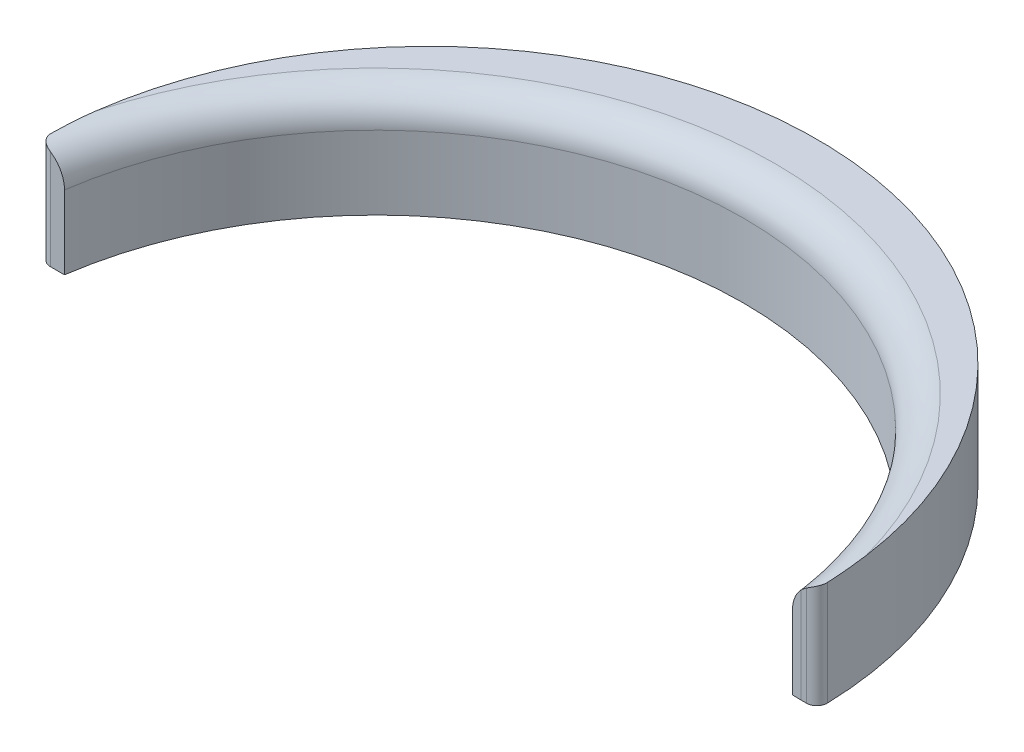
ISO-10303-21;
HEADER;
FILE_DESCRIPTION(('STEP AP214'),'2;1');
FILE_NAME('part.step','',(''),(''),'','','');
FILE_SCHEMA(('AUTOMOTIVE_DESIGN { 1 0 10303 214 1 1 1 1 }'));
ENDSEC;
DATA;
#1=APPLICATION_CONTEXT('core data for automotive mechanical design processes');
#2=APPLICATION_PROTOCOL_DEFINITION('international standard','automotive_design',2000,#1);
#3=PRODUCT_CONTEXT('',#1,'mechanical');
#4=PRODUCT('Part','Part','',(#3));
#5=PRODUCT_RELATED_PRODUCT_CATEGORY('part','',(#4));
#6=PRODUCT_DEFINITION_FORMATION('','',#4);
#7=PRODUCT_DEFINITION_CONTEXT('part definition',#1,'design');
#8=PRODUCT_DEFINITION('design','',#6,#7);
#9=PRODUCT_DEFINITION_SHAPE('','',#8);
#10=(LENGTH_UNIT() NAMED_UNIT(*) SI_UNIT(.MILLI.,.METRE.));
#11=(NAMED_UNIT(*) PLANE_ANGLE_UNIT() SI_UNIT($,.RADIAN.));
#12=(NAMED_UNIT(*) SI_UNIT($,.STERADIAN.) SOLID_ANGLE_UNIT());
#13=UNCERTAINTY_MEASURE_WITH_UNIT(LENGTH_MEASURE(1.E-05),#10,'distance_accuracy_value','');
#14=(GEOMETRIC_REPRESENTATION_CONTEXT(3) GLOBAL_UNCERTAINTY_ASSIGNED_CONTEXT((#13)) GLOBAL_UNIT_ASSIGNED_CONTEXT((#10,
#11,#12)) REPRESENTATION_CONTEXT('',''));
#15=CARTESIAN_POINT('',(0.,0.,0.));
#16=DIRECTION('',(0.,0.,1.));
#17=DIRECTION('',(1.,0.,0.));
#18=AXIS2_PLACEMENT_3D('',#15,#16,#17);
#19=CARTESIAN_POINT('',(35.6673377429579,10.,-0.746761216356014));
#20=DIRECTION('',(0.,-1.,0.));
#21=DIRECTION('',(0.,0.,-1.));
#22=AXIS2_PLACEMENT_3D('',#19,#20,#21);
#23=CYLINDRICAL_SURFACE('',#22,0.999999999999998);
#24=DIRECTION('',(0.,-1.,0.));
#25=VECTOR('',#24,1.);
#26=CARTESIAN_POINT('',(36.6669518660382,10.,-0.774538994133789));
#27=LINE('',#26,#25);
#28=CARTESIAN_POINT('',(36.6669518660382,9.95347295514484,-0.774538994133789));
#29=VERTEX_POINT('',#28);
#30=CARTESIAN_POINT('',(36.6669518660382,0.,-0.774538994133789));
#31=VERTEX_POINT('',#30);
#32=EDGE_CURVE('E104',#29,#31,#27,.T.);
#33=ORIENTED_EDGE('',*,*,#32,.F.);
#34=CARTESIAN_POINT('',(36.6669518660382,9.95347295514484,-0.774538994133789));
#35=CARTESIAN_POINT('',(36.6677177649557,9.95281561278644,-0.746978266186772));
#36=CARTESIAN_POINT('',(36.667342509577,9.95195969483395,-0.719403532577362));
#37=CARTESIAN_POINT('',(36.6643209347244,9.94981458064419,-0.664396094633847));
#38=CARTESIAN_POINT('',(36.6616746396108,9.94852538905451,-0.636963388779462));
#39=CARTESIAN_POINT('',(36.6503571073224,9.94395815010265,-0.555212358358433));
#40=CARTESIAN_POINT('',(36.6383093905742,9.93997872319311,-0.501359417863415));
#41=CARTESIAN_POINT('',(36.6056157370525,9.92974458732698,-0.396540808380937));
#42=CARTESIAN_POINT('',(36.5849634167148,9.9234881895731,-0.345577314966582));
#43=CARTESIAN_POINT('',(36.5358178563328,9.90821522005778,-0.248041723550171));
#44=CARTESIAN_POINT('',(36.5073269874834,9.89919948291591,-0.201468303243169));
#45=CARTESIAN_POINT('',(36.4437844852529,9.87801176435888,-0.114287260975173));
#46=CARTESIAN_POINT('',(36.4087726379034,9.86585875918813,-0.0736459946923469));
#47=CARTESIAN_POINT('',(36.3334636225369,9.83805654665239,0.000958762202164875));
#48=CARTESIAN_POINT('',(36.2931682152489,9.82240850278093,0.0349244680410152));
#49=CARTESIAN_POINT('',(36.2084541544514,9.78734493870948,0.0958176090502823));
#50=CARTESIAN_POINT('',(36.1640016557967,9.7678967788605,0.122678948883811));
#51=CARTESIAN_POINT('',(36.0728315060392,9.72542677378126,0.168766838427426));
#52=CARTESIAN_POINT('',(36.026110195356,9.70239901349303,0.187980560389305));
#53=CARTESIAN_POINT('',(35.9268768478424,9.65048179584934,0.220527048267496));
#54=CARTESIAN_POINT('',(35.8742774341242,9.62122939056602,0.23301698000759));
#55=CARTESIAN_POINT('',(35.7959899682977,9.57494724380538,0.245280634579662));
#56=CARTESIAN_POINT('',(35.7700257720354,9.55913894259494,0.248290223185543));
#57=CARTESIAN_POINT('',(35.7184175112046,9.52680137994875,0.252267449934033));
#58=CARTESIAN_POINT('',(35.6927732199063,9.51027267139999,0.2532366268052));
#59=CARTESIAN_POINT('',(35.6673377429579,9.49341591735362,0.253238783643984));
#60=B_SPLINE_CURVE_WITH_KNOTS('',3,(#34,#35,#36,#37,#38,#39,#40,#41,#42,#43,#44,#45,#46,#47,#48,
#49,#50,#51,#52,#53,#54,#55,#56,#57,#58,#59),.UNSPECIFIED.,.F.,.F.,(4,2,2,2,2,2,2,2,2,2,2,2,4),
(0.,0.0826873615500514,0.16537383616861,0.330504639513277,0.495758168485683,0.660961762408801,
0.825188601165569,0.989360850304414,1.15501064278994,1.32093712908249,1.50451124734259,
1.5960866812825,1.68759303098725),.UNSPECIFIED.);
#61=CARTESIAN_POINT('',(35.6673377429579,9.49341591735362,0.253238783643986));
#62=VERTEX_POINT('',#61);
#63=EDGE_CURVE('E181',#29,#62,#60,.T.);
#64=ORIENTED_EDGE('',*,*,#63,.T.);
#65=DIRECTION('',(0.,-1.,0.));
#66=VECTOR('',#65,1.);
#67=CARTESIAN_POINT('',(35.6673377429579,10.,0.253238783643986));
#68=LINE('',#67,#66);
#69=CARTESIAN_POINT('',(35.6673377429579,0.,0.253238783643986));
#70=VERTEX_POINT('',#69);
#71=EDGE_CURVE('E128',#62,#70,#68,.T.);
#72=ORIENTED_EDGE('',*,*,#71,.T.);
#73=CARTESIAN_POINT('',(35.6673377429579,0.,-0.746761216356014));
#74=DIRECTION('',(0.,1.,0.));
#75=DIRECTION('',(0.,0.,1.));
#76=AXIS2_PLACEMENT_3D('',#73,#74,#75);
#77=CIRCLE('',#76,0.999999999999998);
#78=EDGE_CURVE('E122',#70,#31,#77,.T.);
#79=ORIENTED_EDGE('',*,*,#78,.T.);
#80=EDGE_LOOP('',(#33,#64,#72,#79));
#81=FACE_BOUND('',#80,.T.);
#82=ADVANCED_FACE('F35',(#81),#23,.T.);
#83=CARTESIAN_POINT('',(-0.318770687935286,10.,0.253238783643986));
#84=DIRECTION('',(0.,-1.,0.));
#85=DIRECTION('',(0.,0.,-1.));
#86=AXIS2_PLACEMENT_3D('',#83,#84,#85);
#87=CYLINDRICAL_SURFACE('',#86,37.);
#88=CARTESIAN_POINT('',(-0.318770687935286,10.,0.253238783643986));
#89=DIRECTION('',(0.,1.,0.));
#90=DIRECTION('',(0.,0.,1.));
#91=AXIS2_PLACEMENT_3D('',#88,#89,#90);
#92=CIRCLE('',#91,37.);
#93=CARTESIAN_POINT('',(36.3418348717114,10.,-4.74676121635612));
#94=VERTEX_POINT('',#93);
#95=CARTESIAN_POINT('',(-36.979376247582,10.,-4.74676121635612));
#96=VERTEX_POINT('',#95);
#97=EDGE_CURVE('E136',#94,#96,#92,.T.);
#98=ORIENTED_EDGE('',*,*,#97,.F.);
#99=CARTESIAN_POINT('',(36.3418348717114,10.,-4.74676121635612));
#100=CARTESIAN_POINT('',(36.3867614959071,9.9999989734785,-4.41736329071418));
#101=CARTESIAN_POINT('',(36.4272460965646,9.99906073464451,-4.0873593394661));
#102=CARTESIAN_POINT('',(36.4992792243283,9.99526369806856,-3.42664257605189));
#103=CARTESIAN_POINT('',(36.5308345227673,9.99240636120814,-3.09593049368062));
#104=CARTESIAN_POINT('',(36.5850246466584,9.98472524462354,-2.43380830405036));
#105=CARTESIAN_POINT('',(36.6076597237996,9.97990152038991,-2.10239821675128));
#106=CARTESIAN_POINT('',(36.6440114954486,9.96822491218437,-1.43887200634617));
#107=CARTESIAN_POINT('',(36.6577213905794,9.96137048695558,-1.1067555378874));
#108=CARTESIAN_POINT('',(36.6669518660382,9.95347295514484,-0.77453899413379));
#109=B_SPLINE_CURVE_WITH_KNOTS('',3,(#99,#100,#101,#102,#103,#104,#105,#106,#107,#108),
.UNSPECIFIED.,.F.,.F.,(4,2,2,2,4),(0.,0.997311483326691,1.99386463899086,2.99038967432094,
3.98767299612027),.UNSPECIFIED.);
#110=EDGE_CURVE('E111',#94,#29,#109,.T.);
#111=ORIENTED_EDGE('',*,*,#110,.T.);
#112=ORIENTED_EDGE('',*,*,#32,.T.);
#113=CARTESIAN_POINT('',(-0.318770687935286,0.,0.253238783643986));
#114=DIRECTION('',(0.,1.,0.));
#115=DIRECTION('',(0.,0.,1.));
#116=AXIS2_PLACEMENT_3D('',#113,#114,#115);
#117=CIRCLE('',#116,37.);
#118=CARTESIAN_POINT('',(-37.3044932419088,0.,-0.774538994133791));
#119=VERTEX_POINT('',#118);
#120=EDGE_CURVE('E109',#31,#119,#117,.T.);
#121=ORIENTED_EDGE('',*,*,#120,.T.);
#122=DIRECTION('',(0.,-1.,0.));
#123=VECTOR('',#122,1.);
#124=CARTESIAN_POINT('',(-37.3044932419088,10.,-0.774538994133791));
#125=LINE('',#124,#123);
#126=CARTESIAN_POINT('',(-37.3044932419088,9.95347295514484,-0.774538994133791));
#127=VERTEX_POINT('',#126);
#128=EDGE_CURVE('E116',#127,#119,#125,.T.);
#129=ORIENTED_EDGE('',*,*,#128,.F.);
#130=CARTESIAN_POINT('',(-37.3044932419088,9.95347295514484,-0.774538994133791));
#131=CARTESIAN_POINT('',(-37.29526276645,9.96137048695558,-1.1067555378874));
#132=CARTESIAN_POINT('',(-37.2815528713191,9.96822491218437,-1.43887200634617));
#133=CARTESIAN_POINT('',(-37.2452010996701,9.97990152038991,-2.10239821675128));
#134=CARTESIAN_POINT('',(-37.222566022529,9.98472524462354,-2.43380830405036));
#135=CARTESIAN_POINT('',(-37.1683758986379,9.99240636120814,-3.09593049368062));
#136=CARTESIAN_POINT('',(-37.1368206001989,9.99526369806856,-3.42664257605189));
#137=CARTESIAN_POINT('',(-37.0647874724351,9.99906073464451,-4.0873593394661));
#138=CARTESIAN_POINT('',(-37.0243028717777,9.9999989734785,-4.41736329071419));
#139=CARTESIAN_POINT('',(-36.979376247582,10.,-4.74676121635612));
#140=B_SPLINE_CURVE_WITH_KNOTS('',3,(#130,#131,#132,#133,#134,#135,#136,#137,#138,#139),
.UNSPECIFIED.,.F.,.F.,(4,2,2,2,4),(0.,0.997283321799329,1.99380835712941,2.99036151279358,
3.98767299612027),.UNSPECIFIED.);
#141=EDGE_CURVE('E163',#127,#96,#140,.T.);
#142=ORIENTED_EDGE('',*,*,#141,.T.);
#143=EDGE_LOOP('',(#98,#111,#112,#121,#129,#142));
#144=FACE_BOUND('',#143,.T.);
#145=ADVANCED_FACE('F107',(#144),#87,.T.);
#146=CARTESIAN_POINT('',(-36.3048791188285,10.,-0.746761216356014));
#147=DIRECTION('',(0.,-1.,0.));
#148=DIRECTION('',(0.,0.,-1.));
#149=AXIS2_PLACEMENT_3D('',#146,#147,#148);
#150=CYLINDRICAL_SURFACE('',#149,0.999999999999998);
#151=DIRECTION('',(0.,-1.,0.));
#152=VECTOR('',#151,1.);
#153=CARTESIAN_POINT('',(-36.3048791188285,10.,0.253238783643986));
#154=LINE('',#153,#152);
#155=CARTESIAN_POINT('',(-36.3048791188285,9.49341591735362,0.253238783643986));
#156=VERTEX_POINT('',#155);
#157=CARTESIAN_POINT('',(-36.3048791188285,0.,0.253238783643986));
#158=VERTEX_POINT('',#157);
#159=EDGE_CURVE('E158',#156,#158,#154,.T.);
#160=ORIENTED_EDGE('',*,*,#159,.F.);
#161=CARTESIAN_POINT('',(-36.3048791188285,9.49341591735362,0.253238783643986));
#162=CARTESIAN_POINT('',(-36.3324395407472,9.5116815685914,0.253236169589167));
#163=CARTESIAN_POINT('',(-36.3602464820766,9.52956184561908,0.252098256880637));
#164=CARTESIAN_POINT('',(-36.4162228228482,9.56446929463335,0.247419055628439));
#165=CARTESIAN_POINT('',(-36.4443925120625,9.58149572358863,0.243875711520499));
#166=CARTESIAN_POINT('',(-36.529431393476,9.63127283724693,0.229397614811864));
#167=CARTESIAN_POINT('',(-36.5865801759764,9.66255555319253,0.214612349352837));
#168=CARTESIAN_POINT('',(-36.699725829006,9.72049460599043,0.173960650875201));
#169=CARTESIAN_POINT('',(-36.7557147882015,9.7471249793264,0.148034659200257));
#170=CARTESIAN_POINT('',(-36.8634062955231,9.79499563957624,0.0850542542616638));
#171=CARTESIAN_POINT('',(-36.9151216243804,9.81625242084236,0.0480346768488432));
#172=CARTESIAN_POINT('',(-37.0056473564914,9.85117518615052,-0.0311563028202333));
#173=CARTESIAN_POINT('',(-37.0452625180723,9.86545164767639,-0.0721435272189871));
#174=CARTESIAN_POINT('',(-37.117380576256,9.89024541764799,-0.161002525667899));
#175=CARTESIAN_POINT('',(-37.1498799434069,9.90076086225074,-0.208877696736648));
#176=CARTESIAN_POINT('',(-37.2045994154319,9.91799556922097,-0.306912785397937));
#177=CARTESIAN_POINT('',(-37.2273210678634,9.92490545804521,-0.356761008053013));
#178=CARTESIAN_POINT('',(-37.2643561580502,9.93633417084214,-0.459723073064165));
#179=CARTESIAN_POINT('',(-37.2786763333897,9.94085491050912,-0.512834260809613));
#180=CARTESIAN_POINT('',(-37.294812694661,9.9466445592609,-0.601004290428038));
#181=CARTESIAN_POINT('',(-37.2992863590129,9.94849807762757,-0.635563000383166));
#182=CARTESIAN_POINT('',(-37.3046093284945,9.95149559896241,-0.704937113739001));
#183=CARTESIAN_POINT('',(-37.3054640227749,9.9526406547571,-0.739752058063464));
#184=CARTESIAN_POINT('',(-37.3044932419088,9.95347295514484,-0.77453899413379));
#185=B_SPLINE_CURVE_WITH_KNOTS('',3,(#161,#162,#163,#164,#165,#166,#167,#168,#169,#170,#171,
#172,#173,#174,#175,#176,#177,#178,#179,#180,#181,#182,#183,#184),.UNSPECIFIED.,.F.,.F.,(4,2,2,
2,2,2,2,2,2,2,2,4),(0.,0.099148257050917,0.198381348196021,0.397737747312347,0.598173436270333,
0.79798620164112,0.973356280832811,1.14881314795556,1.31369331305647,1.47844107073957,
1.58294872760618,1.68730070315969),.UNSPECIFIED.);
#186=EDGE_CURVE('E11',#156,#127,#185,.T.);
#187=ORIENTED_EDGE('',*,*,#186,.T.);
#188=ORIENTED_EDGE('',*,*,#128,.T.);
#189=CARTESIAN_POINT('',(-36.3048791188285,0.,-0.746761216356014));
#190=DIRECTION('',(0.,1.,0.));
#191=DIRECTION('',(0.,0.,-1.));
#192=AXIS2_PLACEMENT_3D('',#189,#190,#191);
#193=CIRCLE('',#192,0.999999999999998);
#194=EDGE_CURVE('E125',#119,#158,#193,.T.);
#195=ORIENTED_EDGE('',*,*,#194,.T.);
#196=EDGE_LOOP('',(#160,#187,#188,#195));
#197=FACE_BOUND('',#196,.T.);
#198=ADVANCED_FACE('F175',(#197),#150,.T.);
#199=CARTESIAN_POINT('',(-35.815249386533,10.,0.253238783643986));
#200=DIRECTION('',(0.,0.,-1.));
#201=DIRECTION('',(-1.,0.,0.));
#202=AXIS2_PLACEMENT_3D('',#199,#200,#201);
#203=PLANE('',#202);
#204=DIRECTION('',(0.,-1.,0.));
#205=VECTOR('',#204,1.);
#206=CARTESIAN_POINT('',(-34.9597868393128,10.,0.253238783643968));
#207=LINE('',#206,#205);
#208=CARTESIAN_POINT('',(-34.9597868393128,7.,0.253238783643968));
#209=VERTEX_POINT('',#208);
#210=CARTESIAN_POINT('',(-34.9597868393128,0.,0.253238783643968));
#211=VERTEX_POINT('',#210);
#212=EDGE_CURVE('E156',#209,#211,#207,.T.);
#213=ORIENTED_EDGE('',*,*,#212,.F.);
#214=CARTESIAN_POINT('',(-34.9597868393128,7.,0.253238783643968));
#215=CARTESIAN_POINT('',(-34.9597781515969,7.08379847133382,0.253238783643979));
#216=CARTESIAN_POINT('',(-34.9633342614162,7.16759282416034,0.253238783643984));
#217=CARTESIAN_POINT('',(-34.977508950757,7.33457664340067,0.253238783643988));
#218=CARTESIAN_POINT('',(-34.9881270594083,7.41776614976975,0.253238783643986));
#219=CARTESIAN_POINT('',(-35.0163331719136,7.58280595245576,0.253238783643985));
#220=CARTESIAN_POINT('',(-35.033908567077,7.66465839404019,0.253238783643986));
#221=CARTESIAN_POINT('',(-35.0758783095347,7.82657108863648,0.253238783643986));
#222=CARTESIAN_POINT('',(-35.100272567055,7.90663136522818,0.253238783643986));
#223=CARTESIAN_POINT('',(-35.1834825849753,8.14338493543783,0.253238783643986));
#224=CARTESIAN_POINT('',(-35.2523318773118,8.29668751298472,0.253238783643986));
#225=CARTESIAN_POINT('',(-35.4146342548147,8.58955093535516,0.253238783643986));
#226=CARTESIAN_POINT('',(-35.5080892538713,8.72911071007018,0.253238783643986));
#227=CARTESIAN_POINT('',(-35.7104642404423,8.98267519347137,0.253238783643986));
#228=CARTESIAN_POINT('',(-35.8180666278657,9.097727705041,0.253238783643986));
#229=CARTESIAN_POINT('',(-35.9918089109246,9.25668013462871,0.253238783643986));
#230=CARTESIAN_POINT('',(-36.0518219812935,9.30742142960337,0.253238783643986));
#231=CARTESIAN_POINT('',(-36.1756122367291,9.40408998405461,0.253238783643986));
#232=CARTESIAN_POINT('',(-36.2393895915223,9.45001702620338,0.253238783643986));
#233=CARTESIAN_POINT('',(-36.3048791188285,9.49341591735362,0.253238783643986));
#234=B_SPLINE_CURVE_WITH_KNOTS('',3,(#214,#215,#216,#217,#218,#219,#220,#221,#222,#223,#224,
#225,#226,#227,#228,#229,#230,#231,#232,#233),.UNSPECIFIED.,.F.,.F.,(4,2,2,2,2,2,2,2,2,4),(0.,
0.25131264297617,0.5026085309551,0.753451065231797,1.00429029718555,1.50585891963266,
2.00746656680803,2.4779832587225,2.71354444796885,2.94911626648009),.UNSPECIFIED.);
#235=EDGE_CURVE('E48',#209,#156,#234,.T.);
#236=ORIENTED_EDGE('',*,*,#235,.T.);
#237=ORIENTED_EDGE('',*,*,#159,.T.);
#238=DIRECTION('',(1.,0.,0.));
#239=VECTOR('',#238,1.);
#240=CARTESIAN_POINT('',(-35.815249386533,0.,0.253238783643986));
#241=LINE('',#240,#239);
#242=EDGE_CURVE('E140',#158,#211,#241,.T.);
#243=ORIENTED_EDGE('',*,*,#242,.T.);
#244=EDGE_LOOP('',(#213,#236,#237,#243));
#245=FACE_BOUND('',#244,.T.);
#246=ADVANCED_FACE('F212',(#245),#203,.F.);
#247=CARTESIAN_POINT('',(-0.318770687935286,10.,5.25323878364399));
#248=DIRECTION('',(0.,-1.,0.));
#249=DIRECTION('',(0.,0.,-1.));
#250=AXIS2_PLACEMENT_3D('',#247,#248,#249);
#251=CYLINDRICAL_SURFACE('',#250,35.);
#252=DIRECTION('',(0.,-1.,0.));
#253=VECTOR('',#252,1.);
#254=CARTESIAN_POINT('',(34.3188268972917,10.,0.229611257256392));
#255=LINE('',#254,#253);
#256=CARTESIAN_POINT('',(34.3188268972917,7.,0.229611257256392));
#257=VERTEX_POINT('',#256);
#258=CARTESIAN_POINT('',(34.3188268972917,0.,0.229611257256392));
#259=VERTEX_POINT('',#258);
#260=EDGE_CURVE('E154',#257,#259,#255,.T.);
#261=ORIENTED_EDGE('',*,*,#260,.F.);
#262=CARTESIAN_POINT('',(-0.318770687935286,7.,5.25323878364399));
#263=DIRECTION('',(0.,1.,0.));
#264=DIRECTION('',(0.,0.,1.));
#265=AXIS2_PLACEMENT_3D('',#262,#263,#264);
#266=CIRCLE('',#265,35.);
#267=EDGE_CURVE('E62',#257,#209,#266,.T.);
#268=ORIENTED_EDGE('',*,*,#267,.T.);
#269=ORIENTED_EDGE('',*,*,#212,.T.);
#270=CARTESIAN_POINT('',(-0.318770687935286,0.,5.25323878364399));
#271=DIRECTION('',(0.,-1.,0.));
#272=DIRECTION('',(0.,0.,1.));
#273=AXIS2_PLACEMENT_3D('',#270,#271,#272);
#274=CIRCLE('',#273,35.);
#275=EDGE_CURVE('E143',#211,#259,#274,.T.);
#276=ORIENTED_EDGE('',*,*,#275,.T.);
#277=EDGE_LOOP('',(#261,#268,#269,#276));
#278=FACE_BOUND('',#277,.T.);
#279=ADVANCED_FACE('F209',(#278),#251,.F.);
#280=CARTESIAN_POINT('',(35.1777080106624,10.,0.253238783643986));
#281=DIRECTION('',(0.0274992553169229,0.,-0.999621823969953));
#282=DIRECTION('',(-0.999621823969953,0.,-0.0274992553169229));
#283=AXIS2_PLACEMENT_3D('',#280,#281,#282);
#284=PLANE('',#283);
#285=DIRECTION('',(0.,-1.,0.));
#286=VECTOR('',#285,1.);
#287=CARTESIAN_POINT('',(35.1777080106624,10.,0.253238783643986));
#288=LINE('',#287,#286);
#289=CARTESIAN_POINT('',(35.1777080106624,9.08905385237143,0.253238783643986));
#290=VERTEX_POINT('',#289);
#291=CARTESIAN_POINT('',(35.1777080106624,0.,0.253238783643986));
#292=VERTEX_POINT('',#291);
#293=EDGE_CURVE('E152',#290,#292,#288,.T.);
#294=ORIENTED_EDGE('',*,*,#293,.F.);
#295=CARTESIAN_POINT('',(35.1777080106624,9.08905385237143,0.253238783643986));
#296=CARTESIAN_POINT('',(35.118787183343,9.02916466860793,0.251617891787599));
#297=CARTESIAN_POINT('',(35.0623757471916,8.96680713839923,0.250066032426063));
#298=CARTESIAN_POINT('',(34.9549525461547,8.83759333489711,0.247110856817208));
#299=CARTESIAN_POINT('',(34.9039411028778,8.77073679404259,0.24570754941723));
#300=CARTESIAN_POINT('',(34.8076444414431,8.63288219742346,0.243058461116575));
#301=CARTESIAN_POINT('',(34.7623666182202,8.56187896240348,0.241812883648031));
#302=CARTESIAN_POINT('',(34.6779635126346,8.41633201132273,0.239490983010825));
#303=CARTESIAN_POINT('',(34.6388377949909,8.34178854623076,0.238414647867734));
#304=CARTESIAN_POINT('',(34.5310818154728,8.11345436102597,0.235450317636401));
#305=CARTESIAN_POINT('',(34.472087902498,7.95498159469661,0.23382741521857));
#306=CARTESIAN_POINT('',(34.3819644580389,7.6306588769854,0.231348150010675));
#307=CARTESIAN_POINT('',(34.3507693519502,7.46482726058394,0.230489983285617));
#308=CARTESIAN_POINT('',(34.3288446551799,7.24826953956378,0.229886842357944));
#309=CARTESIAN_POINT('',(34.3250870440061,7.19866049545756,0.22978347175661));
#310=CARTESIAN_POINT('',(34.3200808217061,7.09937386848507,0.229645752289206));
#311=CARTESIAN_POINT('',(34.3188292873403,7.04969643319165,0.229611323005813));
#312=CARTESIAN_POINT('',(34.3188268972917,7.,0.229611257256392));
#313=B_SPLINE_CURVE_WITH_KNOTS('',3,(#295,#296,#297,#298,#299,#300,#301,#302,#303,#304,#305,
#306,#307,#308,#309,#310,#311,#312),.UNSPECIFIED.,.F.,.F.,(4,2,2,2,2,2,2,2,4),(0.,
0.252012832855008,0.504040666457958,0.756390312041262,1.00872209504895,1.51346419533105,
2.0170124834154,2.16622218896568,2.31525774566245),.UNSPECIFIED.);
#314=EDGE_CURVE('E192',#290,#257,#313,.T.);
#315=ORIENTED_EDGE('',*,*,#314,.T.);
#316=ORIENTED_EDGE('',*,*,#260,.T.);
#317=DIRECTION('',(0.999621823969953,0.,0.0274992553169229));
#318=VECTOR('',#317,1.);
#319=CARTESIAN_POINT('',(35.1777080106624,0.,0.253238783643986));
#320=LINE('',#319,#318);
#321=EDGE_CURVE('E146',#259,#292,#320,.T.);
#322=ORIENTED_EDGE('',*,*,#321,.T.);
#323=EDGE_LOOP('',(#294,#315,#316,#322));
#324=FACE_BOUND('',#323,.T.);
#325=ADVANCED_FACE('F203',(#324),#284,.F.);
#326=CARTESIAN_POINT('',(35.1777080106624,10.,0.253238783643986));
#327=DIRECTION('',(0.,0.,-1.));
#328=DIRECTION('',(-1.,0.,0.));
#329=AXIS2_PLACEMENT_3D('',#326,#327,#328);
#330=PLANE('',#329);
#331=ORIENTED_EDGE('',*,*,#71,.F.);
#332=CARTESIAN_POINT('',(35.6673377429579,9.49341591735362,0.253238783643986));
#333=CARTESIAN_POINT('',(35.5786381984717,9.43461282430031,0.253238783643986));
#334=CARTESIAN_POINT('',(35.4934859401037,9.37151443042466,0.253238783643986));
#335=CARTESIAN_POINT('',(35.3302760325506,9.2367270715412,0.253238783643986));
#336=CARTESIAN_POINT('',(35.2522183801535,9.16503811042279,0.253238783643986));
#337=CARTESIAN_POINT('',(35.1777080106624,9.08905385237143,0.253238783643986));
#338=B_SPLINE_CURVE_WITH_KNOTS('',3,(#332,#333,#334,#335,#336,#337),.UNSPECIFIED.,.F.,.F.,(4,2,
4),(0.,0.317947841215716,0.635895538480397),.UNSPECIFIED.);
#339=EDGE_CURVE('E186',#62,#290,#338,.T.);
#340=ORIENTED_EDGE('',*,*,#339,.T.);
#341=ORIENTED_EDGE('',*,*,#293,.T.);
#342=DIRECTION('',(1.,0.,0.));
#343=VECTOR('',#342,1.);
#344=CARTESIAN_POINT('',(35.1777080106624,0.,0.253238783643986));
#345=LINE('',#344,#343);
#346=EDGE_CURVE('E149',#292,#70,#345,.T.);
#347=ORIENTED_EDGE('',*,*,#346,.T.);
#348=EDGE_LOOP('',(#331,#340,#341,#347));
#349=FACE_BOUND('',#348,.T.);
#350=ADVANCED_FACE('F198',(#349),#330,.F.);
#351=CARTESIAN_POINT('',(35.6673377429579,10.,-0.746761216356014));
#352=DIRECTION('',(0.,1.,0.));
#353=DIRECTION('',(0.,0.,1.));
#354=AXIS2_PLACEMENT_3D('',#351,#352,#353);
#355=PLANE('',#354);
#356=ORIENTED_EDGE('',*,*,#97,.T.);
#357=CARTESIAN_POINT('',(-0.318770687935286,10.,5.25323878364399));
#358=DIRECTION('',(0.,1.,0.));
#359=DIRECTION('',(0.,0.,1.));
#360=AXIS2_PLACEMENT_3D('',#357,#358,#359);
#361=CIRCLE('',#360,38.);
#362=EDGE_CURVE('E115',#96,#94,#361,.F.);
#363=ORIENTED_EDGE('',*,*,#362,.T.);
#364=EDGE_LOOP('',(#356,#363));
#365=FACE_BOUND('',#364,.T.);
#366=ADVANCED_FACE('F202',(#365),#355,.T.);
#367=CARTESIAN_POINT('',(35.6673377429579,0.,-0.746761216356014));
#368=DIRECTION('',(0.,1.,0.));
#369=DIRECTION('',(0.,0.,1.));
#370=AXIS2_PLACEMENT_3D('',#367,#368,#369);
#371=PLANE('',#370);
#372=CARTESIAN_POINT('',(14.6812293120647,0.,-29.7008928178563));
#373=DIRECTION('',(0.,-1.,0.));
#374=DIRECTION('',(0.,0.,1.));
#375=AXIS2_PLACEMENT_3D('',#372,#373,#374);
#376=CIRCLE('',#375,1.5);
#377=CARTESIAN_POINT('',(14.6812293120647,0.,-28.2008928178563));
#378=VERTEX_POINT('',#377);
#379=EDGE_CURVE('E256',#378,#378,#376,.T.);
#380=ORIENTED_EDGE('',*,*,#379,.F.);
#381=EDGE_LOOP('',(#380));
#382=FACE_BOUND('',#381,.T.);
#383=CARTESIAN_POINT('',(-15.3187706879353,0.,-29.7008928178563));
#384=DIRECTION('',(0.,-1.,0.));
#385=DIRECTION('',(0.,0.,-1.));
#386=AXIS2_PLACEMENT_3D('',#383,#384,#385);
#387=CIRCLE('',#386,1.5);
#388=CARTESIAN_POINT('',(-15.3187706879353,0.,-31.2008928178563));
#389=VERTEX_POINT('',#388);
#390=EDGE_CURVE('E133',#389,#389,#387,.T.);
#391=ORIENTED_EDGE('',*,*,#390,.F.);
#392=EDGE_LOOP('',(#391));
#393=FACE_BOUND('',#392,.T.);
#394=ORIENTED_EDGE('',*,*,#78,.F.);
#395=ORIENTED_EDGE('',*,*,#346,.F.);
#396=ORIENTED_EDGE('',*,*,#321,.F.);
#397=ORIENTED_EDGE('',*,*,#275,.F.);
#398=ORIENTED_EDGE('',*,*,#242,.F.);
#399=ORIENTED_EDGE('',*,*,#194,.F.);
#400=ORIENTED_EDGE('',*,*,#120,.F.);
#401=EDGE_LOOP('',(#394,#395,#396,#397,#398,#399,#400));
#402=FACE_BOUND('',#401,.T.);
#403=ADVANCED_FACE('F120',(#382,#393,#402),#371,.F.);
#404=CARTESIAN_POINT('',(-0.318770687935286,7.,5.25323878364399));
#405=DIRECTION('',(0.,1.,0.));
#406=DIRECTION('',(0.,0.,1.));
#407=AXIS2_PLACEMENT_3D('',#404,#405,#406);
#408=TOROIDAL_SURFACE('',#407,38.,3.);
#409=ORIENTED_EDGE('',*,*,#235,.F.);
#410=ORIENTED_EDGE('',*,*,#267,.F.);
#411=ORIENTED_EDGE('',*,*,#314,.F.);
#412=ORIENTED_EDGE('',*,*,#339,.F.);
#413=ORIENTED_EDGE('',*,*,#63,.F.);
#414=ORIENTED_EDGE('',*,*,#110,.F.);
#415=ORIENTED_EDGE('',*,*,#362,.F.);
#416=ORIENTED_EDGE('',*,*,#141,.F.);
#417=ORIENTED_EDGE('',*,*,#186,.F.);
#418=EDGE_LOOP('',(#409,#410,#411,#412,#413,#414,#415,#416,#417));
#419=FACE_BOUND('',#418,.T.);
#420=ADVANCED_FACE('F37',(#419),#408,.T.);
#421=CARTESIAN_POINT('',(-15.3187706879353,7.,-29.7008928178563));
#422=DIRECTION('',(0.,-1.,0.));
#423=DIRECTION('',(0.,0.,-1.));
#424=AXIS2_PLACEMENT_3D('',#421,#422,#423);
#425=CYLINDRICAL_SURFACE('',#424,1.5);
#426=CARTESIAN_POINT('',(-15.3187706879353,7.,-29.7008928178563));
#427=DIRECTION('',(0.,-1.,0.));
#428=DIRECTION('',(0.,0.,-1.));
#429=AXIS2_PLACEMENT_3D('',#426,#427,#428);
#430=CIRCLE('',#429,1.5);
#431=CARTESIAN_POINT('',(-15.3187706879353,7.,-31.2008928178563));
#432=VERTEX_POINT('',#431);
#433=EDGE_CURVE('E130',#432,#432,#430,.T.);
#434=ORIENTED_EDGE('',*,*,#433,.F.);
#435=EDGE_LOOP('',(#434));
#436=FACE_BOUND('',#435,.T.);
#437=ORIENTED_EDGE('',*,*,#390,.T.);
#438=EDGE_LOOP('',(#437));
#439=FACE_BOUND('',#438,.T.);
#440=ADVANCED_FACE('F236',(#436,#439),#425,.F.);
#441=CARTESIAN_POINT('',(-15.3187706879353,7.,-29.7008928178563));
#442=DIRECTION('',(0.,-1.,0.));
#443=DIRECTION('',(0.,0.,-1.));
#444=AXIS2_PLACEMENT_3D('',#441,#442,#443);
#445=PLANE('',#444);
#446=ORIENTED_EDGE('',*,*,#433,.T.);
#447=EDGE_LOOP('',(#446));
#448=FACE_BOUND('',#447,.T.);
#449=ADVANCED_FACE('F239',(#448),#445,.T.);
#450=CARTESIAN_POINT('',(14.6812293120647,7.,-29.7008928178563));
#451=DIRECTION('',(0.,-1.,0.));
#452=DIRECTION('',(0.,0.,-1.));
#453=AXIS2_PLACEMENT_3D('',#450,#451,#452);
#454=CYLINDRICAL_SURFACE('',#453,1.5);
#455=CARTESIAN_POINT('',(14.6812293120647,7.,-29.7008928178563));
#456=DIRECTION('',(0.,-1.,0.));
#457=DIRECTION('',(0.,0.,1.));
#458=AXIS2_PLACEMENT_3D('',#455,#456,#457);
#459=CIRCLE('',#458,1.5);
#460=CARTESIAN_POINT('',(14.6812293120647,7.,-28.2008928178563));
#461=VERTEX_POINT('',#460);
#462=EDGE_CURVE('E255',#461,#461,#459,.T.);
#463=ORIENTED_EDGE('',*,*,#462,.F.);
#464=EDGE_LOOP('',(#463));
#465=FACE_BOUND('',#464,.T.);
#466=ORIENTED_EDGE('',*,*,#379,.T.);
#467=EDGE_LOOP('',(#466));
#468=FACE_BOUND('',#467,.T.);
#469=ADVANCED_FACE('F243',(#465,#468),#454,.F.);
#470=CARTESIAN_POINT('',(14.6812293120647,7.,-29.7008928178563));
#471=DIRECTION('',(0.,1.,0.));
#472=DIRECTION('',(0.,0.,1.));
#473=AXIS2_PLACEMENT_3D('',#470,#471,#472);
#474=PLANE('',#473);
#475=ORIENTED_EDGE('',*,*,#462,.T.);
#476=EDGE_LOOP('',(#475));
#477=FACE_BOUND('',#476,.T.);
#478=ADVANCED_FACE('F247',(#477),#474,.F.);
#479=CLOSED_SHELL('',(#82,#145,#198,#246,#279,#325,#350,#366,#403,#420,#440,#449,#469,#478));
#480=MANIFOLD_SOLID_BREP('B2',#479);
#481=ADVANCED_BREP_SHAPE_REPRESENTATION('',(#18,#480),#14);
#482=SHAPE_DEFINITION_REPRESENTATION(#9,#481);
ENDSEC;
END-ISO-10303-21;
